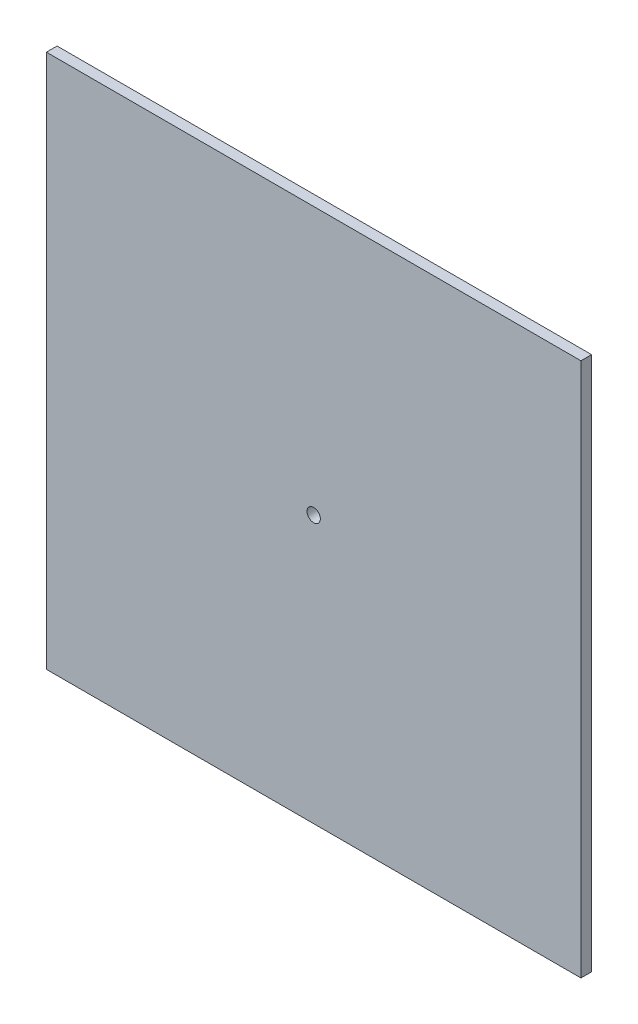
ISO-10303-21;
HEADER;
FILE_DESCRIPTION(('STEP AP214'),'2;1');
FILE_NAME('part.step','',(''),(''),'','','');
FILE_SCHEMA(('AUTOMOTIVE_DESIGN { 1 0 10303 214 1 1 1 1 }'));
ENDSEC;
DATA;
#1=APPLICATION_CONTEXT('core data for automotive mechanical design processes');
#2=APPLICATION_PROTOCOL_DEFINITION('international standard','automotive_design',2000,#1);
#3=PRODUCT_CONTEXT('',#1,'mechanical');
#4=PRODUCT('Part','Part','',(#3));
#5=PRODUCT_RELATED_PRODUCT_CATEGORY('part','',(#4));
#6=PRODUCT_DEFINITION_FORMATION('','',#4);
#7=PRODUCT_DEFINITION_CONTEXT('part definition',#1,'design');
#8=PRODUCT_DEFINITION('design','',#6,#7);
#9=PRODUCT_DEFINITION_SHAPE('','',#8);
#10=(LENGTH_UNIT() NAMED_UNIT(*) SI_UNIT(.MILLI.,.METRE.));
#11=(NAMED_UNIT(*) PLANE_ANGLE_UNIT() SI_UNIT($,.RADIAN.));
#12=(NAMED_UNIT(*) SI_UNIT($,.STERADIAN.) SOLID_ANGLE_UNIT());
#13=UNCERTAINTY_MEASURE_WITH_UNIT(LENGTH_MEASURE(1.E-05),#10,'distance_accuracy_value','');
#14=(GEOMETRIC_REPRESENTATION_CONTEXT(3) GLOBAL_UNCERTAINTY_ASSIGNED_CONTEXT((#13)) GLOBAL_UNIT_ASSIGNED_CONTEXT((#10,
#11,#12)) REPRESENTATION_CONTEXT('',''));
#15=CARTESIAN_POINT('',(0.,0.,0.));
#16=DIRECTION('',(0.,0.,1.));
#17=DIRECTION('',(1.,0.,0.));
#18=AXIS2_PLACEMENT_3D('',#15,#16,#17);
#19=CARTESIAN_POINT('',(0.,0.,4.));
#20=DIRECTION('',(0.,0.,1.));
#21=DIRECTION('',(1.,0.,0.));
#22=AXIS2_PLACEMENT_3D('',#19,#20,#21);
#23=PLANE('',#22);
#24=DIRECTION('',(0.,1.,0.));
#25=VECTOR('',#24,1.);
#26=CARTESIAN_POINT('',(100.4,100.4,4.));
#27=LINE('',#26,#25);
#28=CARTESIAN_POINT('',(100.4,-100.4,4.));
#29=VERTEX_POINT('',#28);
#30=CARTESIAN_POINT('',(100.4,100.4,4.));
#31=VERTEX_POINT('',#30);
#32=EDGE_CURVE('E92',#29,#31,#27,.T.);
#33=ORIENTED_EDGE('',*,*,#32,.T.);
#34=DIRECTION('',(-1.,0.,0.));
#35=VECTOR('',#34,1.);
#36=CARTESIAN_POINT('',(-100.4,100.4,4.));
#37=LINE('',#36,#35);
#38=CARTESIAN_POINT('',(-100.4,100.4,4.));
#39=VERTEX_POINT('',#38);
#40=EDGE_CURVE('E87',#31,#39,#37,.T.);
#41=ORIENTED_EDGE('',*,*,#40,.T.);
#42=DIRECTION('',(0.,-1.,0.));
#43=VECTOR('',#42,1.);
#44=CARTESIAN_POINT('',(-100.4,100.4,4.));
#45=LINE('',#44,#43);
#46=CARTESIAN_POINT('',(-100.4,-100.4,4.));
#47=VERTEX_POINT('',#46);
#48=EDGE_CURVE('E90',#39,#47,#45,.T.);
#49=ORIENTED_EDGE('',*,*,#48,.T.);
#50=DIRECTION('',(1.,0.,0.));
#51=VECTOR('',#50,1.);
#52=CARTESIAN_POINT('',(-100.4,-100.4,4.));
#53=LINE('',#52,#51);
#54=EDGE_CURVE('E57',#47,#29,#53,.T.);
#55=ORIENTED_EDGE('',*,*,#54,.T.);
#56=EDGE_LOOP('',(#33,#41,#49,#55));
#57=FACE_BOUND('',#56,.T.);
#58=CARTESIAN_POINT('',(0.,0.,4.));
#59=DIRECTION('',(0.,0.,1.));
#60=DIRECTION('',(1.,0.,0.));
#61=AXIS2_PLACEMENT_3D('',#58,#59,#60);
#62=CIRCLE('',#61,2.5);
#63=CARTESIAN_POINT('',(2.5,0.,4.));
#64=VERTEX_POINT('',#63);
#65=EDGE_CURVE('E112',#64,#64,#62,.T.);
#66=ORIENTED_EDGE('',*,*,#65,.F.);
#67=EDGE_LOOP('',(#66));
#68=FACE_BOUND('',#67,.T.);
#69=ADVANCED_FACE('F39',(#57,#68),#23,.T.);
#70=CARTESIAN_POINT('',(0.,0.,0.));
#71=DIRECTION('',(0.,0.,1.));
#72=DIRECTION('',(1.,0.,0.));
#73=AXIS2_PLACEMENT_3D('',#70,#71,#72);
#74=PLANE('',#73);
#75=DIRECTION('',(0.,1.,0.));
#76=VECTOR('',#75,1.);
#77=CARTESIAN_POINT('',(100.4,100.4,0.));
#78=LINE('',#77,#76);
#79=CARTESIAN_POINT('',(100.4,-100.4,0.));
#80=VERTEX_POINT('',#79);
#81=CARTESIAN_POINT('',(100.4,100.4,0.));
#82=VERTEX_POINT('',#81);
#83=EDGE_CURVE('E108',#80,#82,#78,.T.);
#84=ORIENTED_EDGE('',*,*,#83,.F.);
#85=DIRECTION('',(1.,0.,0.));
#86=VECTOR('',#85,1.);
#87=CARTESIAN_POINT('',(-100.4,-100.4,0.));
#88=LINE('',#87,#86);
#89=CARTESIAN_POINT('',(-100.4,-100.4,0.));
#90=VERTEX_POINT('',#89);
#91=EDGE_CURVE('E80',#90,#80,#88,.T.);
#92=ORIENTED_EDGE('',*,*,#91,.F.);
#93=DIRECTION('',(0.,-1.,0.));
#94=VECTOR('',#93,1.);
#95=CARTESIAN_POINT('',(-100.4,100.4,0.));
#96=LINE('',#95,#94);
#97=CARTESIAN_POINT('',(-100.4,100.4,0.));
#98=VERTEX_POINT('',#97);
#99=EDGE_CURVE('E74',#98,#90,#96,.T.);
#100=ORIENTED_EDGE('',*,*,#99,.F.);
#101=DIRECTION('',(-1.,0.,0.));
#102=VECTOR('',#101,1.);
#103=CARTESIAN_POINT('',(-100.4,100.4,0.));
#104=LINE('',#103,#102);
#105=EDGE_CURVE('E97',#82,#98,#104,.T.);
#106=ORIENTED_EDGE('',*,*,#105,.F.);
#107=EDGE_LOOP('',(#84,#92,#100,#106));
#108=FACE_BOUND('',#107,.T.);
#109=CARTESIAN_POINT('',(0.,0.,0.));
#110=DIRECTION('',(0.,0.,1.));
#111=DIRECTION('',(1.,0.,0.));
#112=AXIS2_PLACEMENT_3D('',#109,#110,#111);
#113=CIRCLE('',#112,2.5);
#114=CARTESIAN_POINT('',(2.5,0.,0.));
#115=VERTEX_POINT('',#114);
#116=EDGE_CURVE('E130',#115,#115,#113,.T.);
#117=ORIENTED_EDGE('',*,*,#116,.T.);
#118=EDGE_LOOP('',(#117));
#119=FACE_BOUND('',#118,.T.);
#120=ADVANCED_FACE('F125',(#108,#119),#74,.F.);
#121=CARTESIAN_POINT('',(100.4,100.4,4.));
#122=DIRECTION('',(-1.,0.,0.));
#123=DIRECTION('',(0.,-1.,0.));
#124=AXIS2_PLACEMENT_3D('',#121,#122,#123);
#125=PLANE('',#124);
#126=ORIENTED_EDGE('',*,*,#83,.T.);
#127=DIRECTION('',(0.,0.,-1.));
#128=VECTOR('',#127,1.);
#129=CARTESIAN_POINT('',(100.4,100.4,4.));
#130=LINE('',#129,#128);
#131=EDGE_CURVE('E11',#31,#82,#130,.T.);
#132=ORIENTED_EDGE('',*,*,#131,.F.);
#133=ORIENTED_EDGE('',*,*,#32,.F.);
#134=DIRECTION('',(0.,0.,-1.));
#135=VECTOR('',#134,1.);
#136=CARTESIAN_POINT('',(100.4,-100.4,4.));
#137=LINE('',#136,#135);
#138=EDGE_CURVE('E104',#29,#80,#137,.T.);
#139=ORIENTED_EDGE('',*,*,#138,.T.);
#140=EDGE_LOOP('',(#126,#132,#133,#139));
#141=FACE_BOUND('',#140,.T.);
#142=ADVANCED_FACE('F41',(#141),#125,.F.);
#143=CARTESIAN_POINT('',(-100.4,100.4,4.));
#144=DIRECTION('',(0.,-1.,0.));
#145=DIRECTION('',(0.,0.,-1.));
#146=AXIS2_PLACEMENT_3D('',#143,#144,#145);
#147=PLANE('',#146);
#148=ORIENTED_EDGE('',*,*,#105,.T.);
#149=DIRECTION('',(0.,0.,-1.));
#150=VECTOR('',#149,1.);
#151=CARTESIAN_POINT('',(-100.4,100.4,4.));
#152=LINE('',#151,#150);
#153=EDGE_CURVE('E49',#39,#98,#152,.T.);
#154=ORIENTED_EDGE('',*,*,#153,.F.);
#155=ORIENTED_EDGE('',*,*,#40,.F.);
#156=ORIENTED_EDGE('',*,*,#131,.T.);
#157=EDGE_LOOP('',(#148,#154,#155,#156));
#158=FACE_BOUND('',#157,.T.);
#159=ADVANCED_FACE('F96',(#158),#147,.F.);
#160=CARTESIAN_POINT('',(-100.4,100.4,4.));
#161=DIRECTION('',(1.,0.,0.));
#162=DIRECTION('',(0.,1.,0.));
#163=AXIS2_PLACEMENT_3D('',#160,#161,#162);
#164=PLANE('',#163);
#165=ORIENTED_EDGE('',*,*,#99,.T.);
#166=DIRECTION('',(0.,0.,-1.));
#167=VECTOR('',#166,1.);
#168=CARTESIAN_POINT('',(-100.4,-100.4,4.));
#169=LINE('',#168,#167);
#170=EDGE_CURVE('E99',#47,#90,#169,.T.);
#171=ORIENTED_EDGE('',*,*,#170,.F.);
#172=ORIENTED_EDGE('',*,*,#48,.F.);
#173=ORIENTED_EDGE('',*,*,#153,.T.);
#174=EDGE_LOOP('',(#165,#171,#172,#173));
#175=FACE_BOUND('',#174,.T.);
#176=ADVANCED_FACE('F100',(#175),#164,.F.);
#177=CARTESIAN_POINT('',(-100.4,-100.4,4.));
#178=DIRECTION('',(0.,1.,0.));
#179=DIRECTION('',(0.,0.,1.));
#180=AXIS2_PLACEMENT_3D('',#177,#178,#179);
#181=PLANE('',#180);
#182=ORIENTED_EDGE('',*,*,#91,.T.);
#183=ORIENTED_EDGE('',*,*,#138,.F.);
#184=ORIENTED_EDGE('',*,*,#54,.F.);
#185=ORIENTED_EDGE('',*,*,#170,.T.);
#186=EDGE_LOOP('',(#182,#183,#184,#185));
#187=FACE_BOUND('',#186,.T.);
#188=ADVANCED_FACE('F122',(#187),#181,.F.);
#189=CARTESIAN_POINT('',(0.,0.,4.));
#190=DIRECTION('',(0.,0.,-1.));
#191=DIRECTION('',(-1.,0.,0.));
#192=AXIS2_PLACEMENT_3D('',#189,#190,#191);
#193=CYLINDRICAL_SURFACE('',#192,2.5);
#194=ORIENTED_EDGE('',*,*,#65,.T.);
#195=EDGE_LOOP('',(#194));
#196=FACE_BOUND('',#195,.T.);
#197=ORIENTED_EDGE('',*,*,#116,.F.);
#198=EDGE_LOOP('',(#197));
#199=FACE_BOUND('',#198,.T.);
#200=ADVANCED_FACE('F138',(#196,#199),#193,.F.);
#201=CLOSED_SHELL('',(#69,#120,#142,#159,#176,#188,#200));
#202=MANIFOLD_SOLID_BREP('B2',#201);
#203=ADVANCED_BREP_SHAPE_REPRESENTATION('',(#18,#202),#14);
#204=SHAPE_DEFINITION_REPRESENTATION(#9,#203);
ENDSEC;
END-ISO-10303-21;
